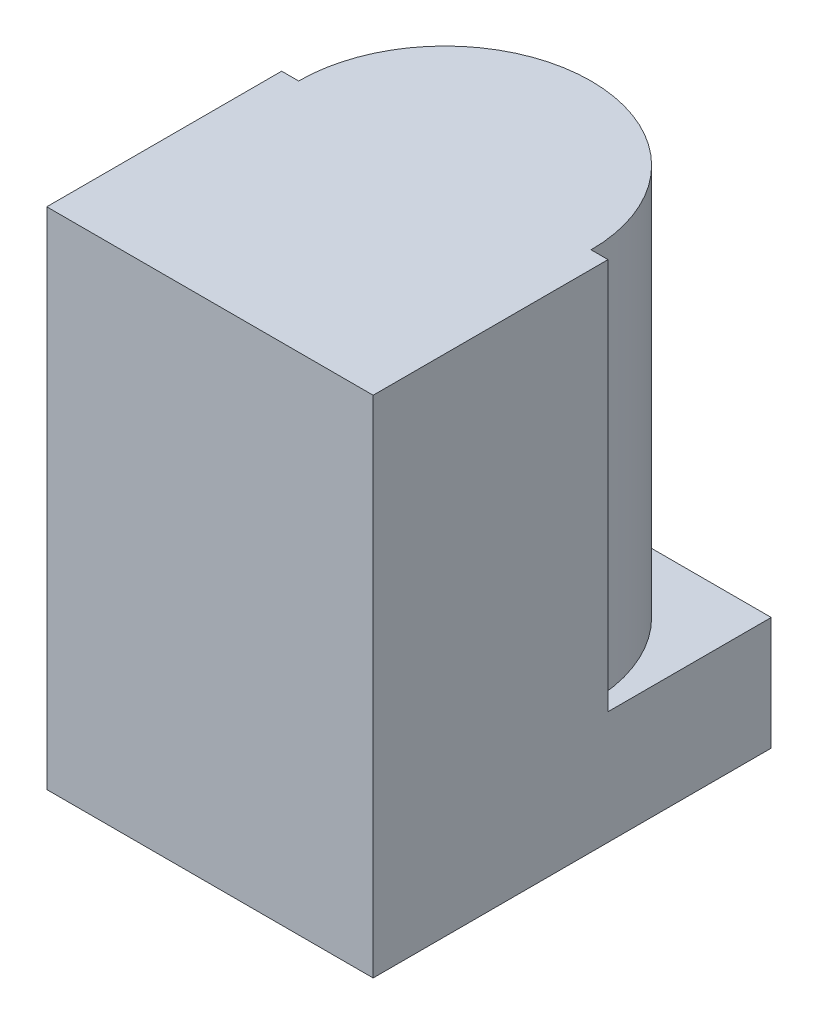
ISO-10303-21;
HEADER;
FILE_DESCRIPTION(('STEP AP214'),'2;1');
FILE_NAME('part.step','',(''),(''),'','','');
FILE_SCHEMA(('AUTOMOTIVE_DESIGN { 1 0 10303 214 1 1 1 1 }'));
ENDSEC;
DATA;
#1=APPLICATION_CONTEXT('core data for automotive mechanical design processes');
#2=APPLICATION_PROTOCOL_DEFINITION('international standard','automotive_design',2000,#1);
#3=PRODUCT_CONTEXT('',#1,'mechanical');
#4=PRODUCT('Part','Part','',(#3));
#5=PRODUCT_RELATED_PRODUCT_CATEGORY('part','',(#4));
#6=PRODUCT_DEFINITION_FORMATION('','',#4);
#7=PRODUCT_DEFINITION_CONTEXT('part definition',#1,'design');
#8=PRODUCT_DEFINITION('design','',#6,#7);
#9=PRODUCT_DEFINITION_SHAPE('','',#8);
#10=(LENGTH_UNIT() NAMED_UNIT(*) SI_UNIT(.MILLI.,.METRE.));
#11=(NAMED_UNIT(*) PLANE_ANGLE_UNIT() SI_UNIT($,.RADIAN.));
#12=(NAMED_UNIT(*) SI_UNIT($,.STERADIAN.) SOLID_ANGLE_UNIT());
#13=UNCERTAINTY_MEASURE_WITH_UNIT(LENGTH_MEASURE(1.E-05),#10,'distance_accuracy_value','');
#14=(GEOMETRIC_REPRESENTATION_CONTEXT(3) GLOBAL_UNCERTAINTY_ASSIGNED_CONTEXT((#13)) GLOBAL_UNIT_ASSIGNED_CONTEXT((#10,
#11,#12)) REPRESENTATION_CONTEXT('',''));
#15=CARTESIAN_POINT('',(0.,0.,0.));
#16=DIRECTION('',(0.,0.,1.));
#17=DIRECTION('',(1.,0.,0.));
#18=AXIS2_PLACEMENT_3D('',#15,#16,#17);
#19=CARTESIAN_POINT('',(0.,13.589,0.));
#20=DIRECTION('',(1.,0.,0.));
#21=DIRECTION('',(0.,0.,-1.));
#22=AXIS2_PLACEMENT_3D('',#19,#20,#21);
#23=PLANE('',#22);
#24=DIRECTION('',(0.,1.,0.));
#25=VECTOR('',#24,1.);
#26=CARTESIAN_POINT('',(0.,-9.82572990672955,-6.32460000000005));
#27=LINE('',#26,#25);
#28=CARTESIAN_POINT('',(0.,3.048,-6.32460000000005));
#29=VERTEX_POINT('',#28);
#30=CARTESIAN_POINT('',(0.,13.589,-6.32460000000005));
#31=VERTEX_POINT('',#30);
#32=EDGE_CURVE('E125',#29,#31,#27,.T.);
#33=ORIENTED_EDGE('',*,*,#32,.F.);
#34=DIRECTION('',(0.,0.,1.));
#35=VECTOR('',#34,1.);
#36=CARTESIAN_POINT('',(0.,3.048,-6.32460000000005));
#37=LINE('',#36,#35);
#38=CARTESIAN_POINT('',(0.,3.048,-10.7188));
#39=VERTEX_POINT('',#38);
#40=EDGE_CURVE('E86',#39,#29,#37,.T.);
#41=ORIENTED_EDGE('',*,*,#40,.F.);
#42=DIRECTION('',(0.,-1.,0.));
#43=VECTOR('',#42,1.);
#44=CARTESIAN_POINT('',(0.,13.589,-10.7188));
#45=LINE('',#44,#43);
#46=CARTESIAN_POINT('',(0.,0.,-10.7188));
#47=VERTEX_POINT('',#46);
#48=EDGE_CURVE('E78',#39,#47,#45,.T.);
#49=ORIENTED_EDGE('',*,*,#48,.T.);
#50=DIRECTION('',(0.,0.,1.));
#51=VECTOR('',#50,1.);
#52=CARTESIAN_POINT('',(0.,0.,0.));
#53=LINE('',#52,#51);
#54=CARTESIAN_POINT('',(0.,0.,0.));
#55=VERTEX_POINT('',#54);
#56=EDGE_CURVE('E83',#47,#55,#53,.T.);
#57=ORIENTED_EDGE('',*,*,#56,.T.);
#58=DIRECTION('',(0.,-1.,0.));
#59=VECTOR('',#58,1.);
#60=CARTESIAN_POINT('',(0.,13.589,0.));
#61=LINE('',#60,#59);
#62=CARTESIAN_POINT('',(0.,13.589,0.));
#63=VERTEX_POINT('',#62);
#64=EDGE_CURVE('E12',#63,#55,#61,.T.);
#65=ORIENTED_EDGE('',*,*,#64,.F.);
#66=DIRECTION('',(0.,0.,1.));
#67=VECTOR('',#66,1.);
#68=CARTESIAN_POINT('',(0.,13.589,0.));
#69=LINE('',#68,#67);
#70=EDGE_CURVE('E99',#31,#63,#69,.T.);
#71=ORIENTED_EDGE('',*,*,#70,.F.);
#72=EDGE_LOOP('',(#33,#41,#49,#57,#65,#71));
#73=FACE_BOUND('',#72,.T.);
#74=ADVANCED_FACE('F35',(#73),#23,.F.);
#75=CARTESIAN_POINT('',(0.,13.589,0.));
#76=DIRECTION('',(0.,0.,-1.));
#77=DIRECTION('',(-1.,0.,0.));
#78=AXIS2_PLACEMENT_3D('',#75,#76,#77);
#79=PLANE('',#78);
#80=DIRECTION('',(1.,0.,0.));
#81=VECTOR('',#80,1.);
#82=CARTESIAN_POINT('',(0.,0.,0.));
#83=LINE('',#82,#81);
#84=CARTESIAN_POINT('',(8.7884,0.,0.));
#85=VERTEX_POINT('',#84);
#86=EDGE_CURVE('E103',#55,#85,#83,.T.);
#87=ORIENTED_EDGE('',*,*,#86,.T.);
#88=DIRECTION('',(0.,-1.,0.));
#89=VECTOR('',#88,1.);
#90=CARTESIAN_POINT('',(8.7884,13.589,0.));
#91=LINE('',#90,#89);
#92=CARTESIAN_POINT('',(8.7884,13.589,0.));
#93=VERTEX_POINT('',#92);
#94=EDGE_CURVE('E42',#93,#85,#91,.T.);
#95=ORIENTED_EDGE('',*,*,#94,.F.);
#96=DIRECTION('',(1.,0.,0.));
#97=VECTOR('',#96,1.);
#98=CARTESIAN_POINT('',(0.,13.589,0.));
#99=LINE('',#98,#97);
#100=EDGE_CURVE('E58',#63,#93,#99,.T.);
#101=ORIENTED_EDGE('',*,*,#100,.F.);
#102=ORIENTED_EDGE('',*,*,#64,.T.);
#103=EDGE_LOOP('',(#87,#95,#101,#102));
#104=FACE_BOUND('',#103,.T.);
#105=ADVANCED_FACE('F120',(#104),#79,.F.);
#106=CARTESIAN_POINT('',(8.7884,13.589,0.));
#107=DIRECTION('',(-1.,0.,0.));
#108=DIRECTION('',(0.,0.,1.));
#109=AXIS2_PLACEMENT_3D('',#106,#107,#108);
#110=PLANE('',#109);
#111=DIRECTION('',(0.,-1.,0.));
#112=VECTOR('',#111,1.);
#113=CARTESIAN_POINT('',(8.7884,13.589,-10.7188));
#114=LINE('',#113,#112);
#115=CARTESIAN_POINT('',(8.7884,3.048,-10.7188));
#116=VERTEX_POINT('',#115);
#117=CARTESIAN_POINT('',(8.7884,0.,-10.7188));
#118=VERTEX_POINT('',#117);
#119=EDGE_CURVE('E89',#116,#118,#114,.T.);
#120=ORIENTED_EDGE('',*,*,#119,.F.);
#121=DIRECTION('',(0.,0.,-1.));
#122=VECTOR('',#121,1.);
#123=CARTESIAN_POINT('',(8.7884,3.048,-10.7188));
#124=LINE('',#123,#122);
#125=CARTESIAN_POINT('',(8.7884,3.048,-6.32460000000005));
#126=VERTEX_POINT('',#125);
#127=EDGE_CURVE('E108',#126,#116,#124,.T.);
#128=ORIENTED_EDGE('',*,*,#127,.F.);
#129=DIRECTION('',(0.,1.,0.));
#130=VECTOR('',#129,1.);
#131=CARTESIAN_POINT('',(8.7884,-9.82572990672955,-6.32460000000005));
#132=LINE('',#131,#130);
#133=CARTESIAN_POINT('',(8.7884,13.589,-6.32460000000005));
#134=VERTEX_POINT('',#133);
#135=EDGE_CURVE('E139',#126,#134,#132,.T.);
#136=ORIENTED_EDGE('',*,*,#135,.T.);
#137=DIRECTION('',(0.,0.,-1.));
#138=VECTOR('',#137,1.);
#139=CARTESIAN_POINT('',(8.7884,13.589,0.));
#140=LINE('',#139,#138);
#141=EDGE_CURVE('E90',#93,#134,#140,.T.);
#142=ORIENTED_EDGE('',*,*,#141,.F.);
#143=ORIENTED_EDGE('',*,*,#94,.T.);
#144=DIRECTION('',(0.,0.,-1.));
#145=VECTOR('',#144,1.);
#146=CARTESIAN_POINT('',(8.7884,0.,0.));
#147=LINE('',#146,#145);
#148=EDGE_CURVE('E100',#85,#118,#147,.T.);
#149=ORIENTED_EDGE('',*,*,#148,.T.);
#150=EDGE_LOOP('',(#120,#128,#136,#142,#143,#149));
#151=FACE_BOUND('',#150,.T.);
#152=ADVANCED_FACE('F117',(#151),#110,.F.);
#153=CARTESIAN_POINT('',(0.,13.589,-10.7188));
#154=DIRECTION('',(0.,0.,1.));
#155=DIRECTION('',(1.,0.,0.));
#156=AXIS2_PLACEMENT_3D('',#153,#154,#155);
#157=PLANE('',#156);
#158=ORIENTED_EDGE('',*,*,#48,.F.);
#159=DIRECTION('',(-1.,0.,0.));
#160=VECTOR('',#159,1.);
#161=CARTESIAN_POINT('',(0.,3.048,-10.7188));
#162=LINE('',#161,#160);
#163=EDGE_CURVE('E104',#116,#39,#162,.T.);
#164=ORIENTED_EDGE('',*,*,#163,.F.);
#165=ORIENTED_EDGE('',*,*,#119,.T.);
#166=DIRECTION('',(-1.,0.,0.));
#167=VECTOR('',#166,1.);
#168=CARTESIAN_POINT('',(0.,0.,-10.7188));
#169=LINE('',#168,#167);
#170=EDGE_CURVE('E93',#118,#47,#169,.T.);
#171=ORIENTED_EDGE('',*,*,#170,.T.);
#172=EDGE_LOOP('',(#158,#164,#165,#171));
#173=FACE_BOUND('',#172,.T.);
#174=ADVANCED_FACE('F94',(#173),#157,.F.);
#175=CARTESIAN_POINT('',(0.,13.589,0.));
#176=DIRECTION('',(0.,-1.,0.));
#177=DIRECTION('',(0.,0.,-1.));
#178=AXIS2_PLACEMENT_3D('',#175,#176,#177);
#179=PLANE('',#178);
#180=CARTESIAN_POINT('',(4.3942,13.589,-6.32460000000005));
#181=DIRECTION('',(0.,-1.,0.));
#182=DIRECTION('',(0.,0.,1.));
#183=AXIS2_PLACEMENT_3D('',#180,#181,#182);
#184=CIRCLE('',#183,3.937);
#185=CARTESIAN_POINT('',(0.457199999999999,13.589,-6.32460000000005));
#186=VERTEX_POINT('',#185);
#187=CARTESIAN_POINT('',(8.3312,13.589,-6.32460000000005));
#188=VERTEX_POINT('',#187);
#189=EDGE_CURVE('E49',#186,#188,#184,.T.);
#190=ORIENTED_EDGE('',*,*,#189,.F.);
#191=DIRECTION('',(1.,0.,0.));
#192=VECTOR('',#191,1.);
#193=CARTESIAN_POINT('',(0.457199999999999,13.589,-6.32460000000005));
#194=LINE('',#193,#192);
#195=EDGE_CURVE('E151',#31,#186,#194,.T.);
#196=ORIENTED_EDGE('',*,*,#195,.F.);
#197=ORIENTED_EDGE('',*,*,#70,.T.);
#198=ORIENTED_EDGE('',*,*,#100,.T.);
#199=ORIENTED_EDGE('',*,*,#141,.T.);
#200=DIRECTION('',(1.,0.,0.));
#201=VECTOR('',#200,1.);
#202=CARTESIAN_POINT('',(8.7884,13.589,-6.32460000000005));
#203=LINE('',#202,#201);
#204=EDGE_CURVE('E150',#188,#134,#203,.T.);
#205=ORIENTED_EDGE('',*,*,#204,.F.);
#206=EDGE_LOOP('',(#190,#196,#197,#198,#199,#205));
#207=FACE_BOUND('',#206,.T.);
#208=ADVANCED_FACE('F194',(#207),#179,.F.);
#209=CARTESIAN_POINT('',(0.,0.,0.));
#210=DIRECTION('',(0.,-1.,0.));
#211=DIRECTION('',(0.,0.,-1.));
#212=AXIS2_PLACEMENT_3D('',#209,#210,#211);
#213=PLANE('',#212);
#214=CARTESIAN_POINT('',(4.3942,0.,-6.32460000000005));
#215=DIRECTION('',(0.,-1.,0.));
#216=DIRECTION('',(0.,0.,-1.));
#217=AXIS2_PLACEMENT_3D('',#214,#215,#216);
#218=CIRCLE('',#217,3.1115);
#219=CARTESIAN_POINT('',(4.3942,0.,-9.43610000000005));
#220=VERTEX_POINT('',#219);
#221=EDGE_CURVE('E161',#220,#220,#218,.T.);
#222=ORIENTED_EDGE('',*,*,#221,.F.);
#223=EDGE_LOOP('',(#222));
#224=FACE_BOUND('',#223,.T.);
#225=ORIENTED_EDGE('',*,*,#56,.F.);
#226=ORIENTED_EDGE('',*,*,#170,.F.);
#227=ORIENTED_EDGE('',*,*,#148,.F.);
#228=ORIENTED_EDGE('',*,*,#86,.F.);
#229=EDGE_LOOP('',(#225,#226,#227,#228));
#230=FACE_BOUND('',#229,.T.);
#231=ADVANCED_FACE('F102',(#224,#230),#213,.T.);
#232=CARTESIAN_POINT('',(0.,3.048,0.));
#233=DIRECTION('',(0.,-1.,0.));
#234=DIRECTION('',(0.,0.,-1.));
#235=AXIS2_PLACEMENT_3D('',#232,#233,#234);
#236=PLANE('',#235);
#237=ORIENTED_EDGE('',*,*,#163,.T.);
#238=ORIENTED_EDGE('',*,*,#40,.T.);
#239=DIRECTION('',(1.,0.,0.));
#240=VECTOR('',#239,1.);
#241=CARTESIAN_POINT('',(0.457199999999999,3.048,-6.32460000000005));
#242=LINE('',#241,#240);
#243=CARTESIAN_POINT('',(0.457199999999999,3.048,-6.32460000000005));
#244=VERTEX_POINT('',#243);
#245=EDGE_CURVE('E132',#29,#244,#242,.T.);
#246=ORIENTED_EDGE('',*,*,#245,.T.);
#247=CARTESIAN_POINT('',(4.3942,3.048,-6.32460000000005));
#248=DIRECTION('',(0.,-1.,0.));
#249=DIRECTION('',(0.,0.,-1.));
#250=AXIS2_PLACEMENT_3D('',#247,#248,#249);
#251=CIRCLE('',#250,3.937);
#252=CARTESIAN_POINT('',(8.3312,3.048,-6.32460000000005));
#253=VERTEX_POINT('',#252);
#254=EDGE_CURVE('E135',#244,#253,#251,.T.);
#255=ORIENTED_EDGE('',*,*,#254,.T.);
#256=DIRECTION('',(1.,0.,0.));
#257=VECTOR('',#256,1.);
#258=CARTESIAN_POINT('',(8.7884,3.048,-6.32460000000005));
#259=LINE('',#258,#257);
#260=EDGE_CURVE('E138',#253,#126,#259,.T.);
#261=ORIENTED_EDGE('',*,*,#260,.T.);
#262=ORIENTED_EDGE('',*,*,#127,.T.);
#263=EDGE_LOOP('',(#237,#238,#246,#255,#261,#262));
#264=FACE_BOUND('',#263,.T.);
#265=ADVANCED_FACE('F193',(#264),#236,.F.);
#266=CARTESIAN_POINT('',(0.457199999999999,-9.82572990672955,-6.32460000000005));
#267=DIRECTION('',(0.,0.,1.));
#268=DIRECTION('',(1.,0.,0.));
#269=AXIS2_PLACEMENT_3D('',#266,#267,#268);
#270=PLANE('',#269);
#271=ORIENTED_EDGE('',*,*,#32,.T.);
#272=ORIENTED_EDGE('',*,*,#195,.T.);
#273=DIRECTION('',(0.,1.,0.));
#274=VECTOR('',#273,1.);
#275=CARTESIAN_POINT('',(0.457199999999999,-9.82572990672955,-6.32460000000005));
#276=LINE('',#275,#274);
#277=EDGE_CURVE('E133',#244,#186,#276,.T.);
#278=ORIENTED_EDGE('',*,*,#277,.F.);
#279=ORIENTED_EDGE('',*,*,#245,.F.);
#280=EDGE_LOOP('',(#271,#272,#278,#279));
#281=FACE_BOUND('',#280,.T.);
#282=ADVANCED_FACE('F213',(#281),#270,.F.);
#283=CARTESIAN_POINT('',(4.3942,-9.82572990672955,-6.32460000000005));
#284=DIRECTION('',(0.,1.,0.));
#285=DIRECTION('',(0.,0.,1.));
#286=AXIS2_PLACEMENT_3D('',#283,#284,#285);
#287=CYLINDRICAL_SURFACE('',#286,3.937);
#288=ORIENTED_EDGE('',*,*,#277,.T.);
#289=ORIENTED_EDGE('',*,*,#189,.T.);
#290=DIRECTION('',(0.,1.,0.));
#291=VECTOR('',#290,1.);
#292=CARTESIAN_POINT('',(8.3312,-9.82572990672955,-6.32460000000005));
#293=LINE('',#292,#291);
#294=EDGE_CURVE('E136',#253,#188,#293,.T.);
#295=ORIENTED_EDGE('',*,*,#294,.F.);
#296=ORIENTED_EDGE('',*,*,#254,.F.);
#297=EDGE_LOOP('',(#288,#289,#295,#296));
#298=FACE_BOUND('',#297,.T.);
#299=ADVANCED_FACE('F217',(#298),#287,.T.);
#300=CARTESIAN_POINT('',(8.7884,-9.82572990672955,-6.32460000000005));
#301=DIRECTION('',(0.,0.,1.));
#302=DIRECTION('',(1.,0.,0.));
#303=AXIS2_PLACEMENT_3D('',#300,#301,#302);
#304=PLANE('',#303);
#305=ORIENTED_EDGE('',*,*,#294,.T.);
#306=ORIENTED_EDGE('',*,*,#204,.T.);
#307=ORIENTED_EDGE('',*,*,#135,.F.);
#308=ORIENTED_EDGE('',*,*,#260,.F.);
#309=EDGE_LOOP('',(#305,#306,#307,#308));
#310=FACE_BOUND('',#309,.T.);
#311=ADVANCED_FACE('F221',(#310),#304,.F.);
#312=CARTESIAN_POINT('',(4.3942,22.3896509986478,-6.32460000000005));
#313=DIRECTION('',(0.,-1.,0.));
#314=DIRECTION('',(0.,0.,-1.));
#315=AXIS2_PLACEMENT_3D('',#312,#313,#314);
#316=CYLINDRICAL_SURFACE('',#315,3.1115);
#317=CARTESIAN_POINT('',(4.3942,11.049,-6.32460000000005));
#318=DIRECTION('',(0.,-1.,0.));
#319=DIRECTION('',(0.,0.,-1.));
#320=AXIS2_PLACEMENT_3D('',#317,#318,#319);
#321=CIRCLE('',#320,3.1115);
#322=CARTESIAN_POINT('',(4.3942,11.049,-9.43610000000005));
#323=VERTEX_POINT('',#322);
#324=EDGE_CURVE('E160',#323,#323,#321,.F.);
#325=ORIENTED_EDGE('',*,*,#324,.T.);
#326=EDGE_LOOP('',(#325));
#327=FACE_BOUND('',#326,.T.);
#328=ORIENTED_EDGE('',*,*,#221,.T.);
#329=EDGE_LOOP('',(#328));
#330=FACE_BOUND('',#329,.T.);
#331=ADVANCED_FACE('F170',(#327,#330),#316,.F.);
#332=CARTESIAN_POINT('',(4.3942,22.3896509986478,-6.32460000000005));
#333=DIRECTION('',(0.,-1.,0.));
#334=DIRECTION('',(0.,0.,-1.));
#335=AXIS2_PLACEMENT_3D('',#332,#333,#334);
#336=CYLINDRICAL_SURFACE('',#335,1.143);
#337=CARTESIAN_POINT('',(4.3942,11.049,-6.32460000000005));
#338=DIRECTION('',(0.,-1.,0.));
#339=DIRECTION('',(0.,0.,-1.));
#340=AXIS2_PLACEMENT_3D('',#337,#338,#339);
#341=CIRCLE('',#340,1.143);
#342=CARTESIAN_POINT('',(4.3942,11.049,-7.46760000000005));
#343=VERTEX_POINT('',#342);
#344=EDGE_CURVE('E154',#343,#343,#341,.F.);
#345=ORIENTED_EDGE('',*,*,#344,.F.);
#346=EDGE_LOOP('',(#345));
#347=FACE_BOUND('',#346,.T.);
#348=CARTESIAN_POINT('',(4.3942,0.,-6.32460000000005));
#349=DIRECTION('',(0.,-1.,0.));
#350=DIRECTION('',(0.,0.,-1.));
#351=AXIS2_PLACEMENT_3D('',#348,#349,#350);
#352=CIRCLE('',#351,1.143);
#353=CARTESIAN_POINT('',(4.3942,0.,-7.46760000000005));
#354=VERTEX_POINT('',#353);
#355=EDGE_CURVE('E164',#354,#354,#352,.T.);
#356=ORIENTED_EDGE('',*,*,#355,.F.);
#357=EDGE_LOOP('',(#356));
#358=FACE_BOUND('',#357,.T.);
#359=ADVANCED_FACE('F177',(#347,#358),#336,.T.);
#360=CARTESIAN_POINT('',(0.,11.049,0.));
#361=DIRECTION('',(0.,-1.,0.));
#362=DIRECTION('',(0.,0.,-1.));
#363=AXIS2_PLACEMENT_3D('',#360,#361,#362);
#364=PLANE('',#363);
#365=ORIENTED_EDGE('',*,*,#324,.F.);
#366=EDGE_LOOP('',(#365));
#367=FACE_BOUND('',#366,.T.);
#368=ORIENTED_EDGE('',*,*,#344,.T.);
#369=EDGE_LOOP('',(#368));
#370=FACE_BOUND('',#369,.T.);
#371=ADVANCED_FACE('F173',(#367,#370),#364,.T.);
#372=ORIENTED_EDGE('',*,*,#355,.T.);
#373=EDGE_LOOP('',(#372));
#374=FACE_BOUND('',#373,.T.);
#375=ADVANCED_FACE('F176',(#374),#213,.T.);
#376=CLOSED_SHELL('',(#74,#105,#152,#174,#208,#231,#265,#282,#299,#311,#331,#359,#371,#375));
#377=MANIFOLD_SOLID_BREP('B2',#376);
#378=ADVANCED_BREP_SHAPE_REPRESENTATION('',(#18,#377),#14);
#379=SHAPE_DEFINITION_REPRESENTATION(#9,#378);
ENDSEC;
END-ISO-10303-21;
